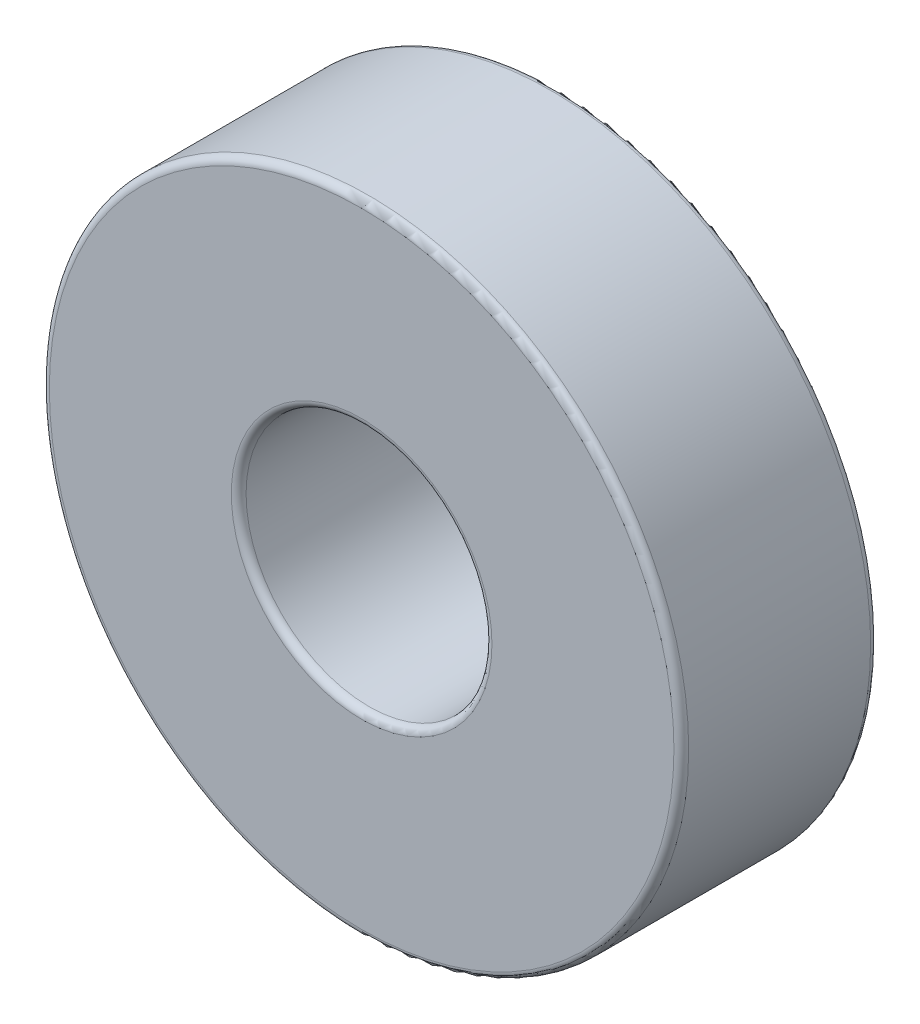
ISO-10303-21;
HEADER;
FILE_DESCRIPTION(('STEP AP214'),'2;1');
FILE_NAME('part.step','',(''),(''),'','','');
FILE_SCHEMA(('AUTOMOTIVE_DESIGN { 1 0 10303 214 1 1 1 1 }'));
ENDSEC;
DATA;
#1=APPLICATION_CONTEXT('core data for automotive mechanical design processes');
#2=APPLICATION_PROTOCOL_DEFINITION('international standard','automotive_design',2000,#1);
#3=PRODUCT_CONTEXT('',#1,'mechanical');
#4=PRODUCT('Part','Part','',(#3));
#5=PRODUCT_RELATED_PRODUCT_CATEGORY('part','',(#4));
#6=PRODUCT_DEFINITION_FORMATION('','',#4);
#7=PRODUCT_DEFINITION_CONTEXT('part definition',#1,'design');
#8=PRODUCT_DEFINITION('design','',#6,#7);
#9=PRODUCT_DEFINITION_SHAPE('','',#8);
#10=(LENGTH_UNIT() NAMED_UNIT(*) SI_UNIT(.MILLI.,.METRE.));
#11=(NAMED_UNIT(*) PLANE_ANGLE_UNIT() SI_UNIT($,.RADIAN.));
#12=(NAMED_UNIT(*) SI_UNIT($,.STERADIAN.) SOLID_ANGLE_UNIT());
#13=UNCERTAINTY_MEASURE_WITH_UNIT(LENGTH_MEASURE(1.E-05),#10,'distance_accuracy_value','');
#14=(GEOMETRIC_REPRESENTATION_CONTEXT(3) GLOBAL_UNCERTAINTY_ASSIGNED_CONTEXT((#13)) GLOBAL_UNIT_ASSIGNED_CONTEXT((#10,
#11,#12)) REPRESENTATION_CONTEXT('',''));
#15=CARTESIAN_POINT('',(0.,0.,0.));
#16=DIRECTION('',(0.,0.,1.));
#17=DIRECTION('',(1.,0.,0.));
#18=AXIS2_PLACEMENT_3D('',#15,#16,#17);
#19=CARTESIAN_POINT('',(0.,5.3,11.5));
#20=DIRECTION('',(0.,0.,1.));
#21=DIRECTION('',(1.,0.,0.));
#22=AXIS2_PLACEMENT_3D('',#19,#20,#21);
#23=PLANE('',#22);
#24=CARTESIAN_POINT('',(0.,0.,11.5));
#25=DIRECTION('',(0.,0.,1.));
#26=DIRECTION('',(1.,0.,0.));
#27=AXIS2_PLACEMENT_3D('',#24,#25,#26);
#28=CIRCLE('',#27,12.7);
#29=CARTESIAN_POINT('',(12.7,0.,11.5));
#30=VERTEX_POINT('',#29);
#31=EDGE_CURVE('E53',#30,#30,#28,.T.);
#32=ORIENTED_EDGE('',*,*,#31,.T.);
#33=EDGE_LOOP('',(#32));
#34=FACE_BOUND('',#33,.T.);
#35=CARTESIAN_POINT('',(0.,0.,11.5));
#36=DIRECTION('',(0.,0.,1.));
#37=DIRECTION('',(1.,0.,0.));
#38=AXIS2_PLACEMENT_3D('',#35,#36,#37);
#39=CIRCLE('',#38,5.3);
#40=CARTESIAN_POINT('',(5.3,0.,11.5));
#41=VERTEX_POINT('',#40);
#42=EDGE_CURVE('E10',#41,#41,#39,.T.);
#43=ORIENTED_EDGE('',*,*,#42,.F.);
#44=EDGE_LOOP('',(#43));
#45=FACE_BOUND('',#44,.T.);
#46=ADVANCED_FACE('F14',(#34,#45),#23,.T.);
#47=CARTESIAN_POINT('',(0.,0.,11.2));
#48=DIRECTION('',(0.,0.,1.));
#49=DIRECTION('',(1.,0.,0.));
#50=AXIS2_PLACEMENT_3D('',#47,#48,#49);
#51=TOROIDAL_SURFACE('',#50,5.3,0.3);
#52=CARTESIAN_POINT('',(0.,0.,11.2));
#53=DIRECTION('',(0.,0.,1.));
#54=DIRECTION('',(1.,0.,0.));
#55=AXIS2_PLACEMENT_3D('',#52,#53,#54);
#56=CIRCLE('',#55,5.);
#57=CARTESIAN_POINT('',(5.,0.,11.2));
#58=VERTEX_POINT('',#57);
#59=EDGE_CURVE('E21',#58,#58,#56,.T.);
#60=ORIENTED_EDGE('',*,*,#59,.F.);
#61=EDGE_LOOP('',(#60));
#62=FACE_BOUND('',#61,.T.);
#63=ORIENTED_EDGE('',*,*,#42,.T.);
#64=EDGE_LOOP('',(#63));
#65=FACE_BOUND('',#64,.T.);
#66=ADVANCED_FACE('F80',(#62,#65),#51,.T.);
#67=CARTESIAN_POINT('',(0.,0.,7.5));
#68=DIRECTION('',(0.,0.,1.));
#69=DIRECTION('',(1.,0.,0.));
#70=AXIS2_PLACEMENT_3D('',#67,#68,#69);
#71=CYLINDRICAL_SURFACE('',#70,5.);
#72=CARTESIAN_POINT('',(0.,0.,3.8));
#73=DIRECTION('',(0.,0.,1.));
#74=DIRECTION('',(1.,0.,0.));
#75=AXIS2_PLACEMENT_3D('',#72,#73,#74);
#76=CIRCLE('',#75,5.);
#77=CARTESIAN_POINT('',(5.,0.,3.8));
#78=VERTEX_POINT('',#77);
#79=EDGE_CURVE('E29',#78,#78,#76,.T.);
#80=ORIENTED_EDGE('',*,*,#79,.F.);
#81=EDGE_LOOP('',(#80));
#82=FACE_BOUND('',#81,.T.);
#83=ORIENTED_EDGE('',*,*,#59,.T.);
#84=EDGE_LOOP('',(#83));
#85=FACE_BOUND('',#84,.T.);
#86=ADVANCED_FACE('F84',(#82,#85),#71,.F.);
#87=CARTESIAN_POINT('',(0.,0.,3.8));
#88=DIRECTION('',(0.,0.,1.));
#89=DIRECTION('',(1.,0.,0.));
#90=AXIS2_PLACEMENT_3D('',#87,#88,#89);
#91=TOROIDAL_SURFACE('',#90,5.3,0.3);
#92=CARTESIAN_POINT('',(0.,0.,3.5));
#93=DIRECTION('',(0.,0.,1.));
#94=DIRECTION('',(1.,0.,0.));
#95=AXIS2_PLACEMENT_3D('',#92,#93,#94);
#96=CIRCLE('',#95,5.3);
#97=CARTESIAN_POINT('',(5.3,0.,3.5));
#98=VERTEX_POINT('',#97);
#99=EDGE_CURVE('E35',#98,#98,#96,.T.);
#100=ORIENTED_EDGE('',*,*,#99,.F.);
#101=EDGE_LOOP('',(#100));
#102=FACE_BOUND('',#101,.T.);
#103=ORIENTED_EDGE('',*,*,#79,.T.);
#104=EDGE_LOOP('',(#103));
#105=FACE_BOUND('',#104,.T.);
#106=ADVANCED_FACE('F89',(#102,#105),#91,.T.);
#107=CARTESIAN_POINT('',(0.,5.3,3.5));
#108=DIRECTION('',(0.,0.,1.));
#109=DIRECTION('',(1.,0.,0.));
#110=AXIS2_PLACEMENT_3D('',#107,#108,#109);
#111=PLANE('',#110);
#112=CARTESIAN_POINT('',(0.,0.,3.5));
#113=DIRECTION('',(0.,0.,1.));
#114=DIRECTION('',(1.,0.,0.));
#115=AXIS2_PLACEMENT_3D('',#112,#113,#114);
#116=CIRCLE('',#115,12.7);
#117=CARTESIAN_POINT('',(12.7,0.,3.5));
#118=VERTEX_POINT('',#117);
#119=EDGE_CURVE('E41',#118,#118,#116,.T.);
#120=ORIENTED_EDGE('',*,*,#119,.F.);
#121=EDGE_LOOP('',(#120));
#122=FACE_BOUND('',#121,.T.);
#123=ORIENTED_EDGE('',*,*,#99,.T.);
#124=EDGE_LOOP('',(#123));
#125=FACE_BOUND('',#124,.T.);
#126=ADVANCED_FACE('F76',(#122,#125),#111,.F.);
#127=CARTESIAN_POINT('',(0.,0.,3.8));
#128=DIRECTION('',(0.,0.,1.));
#129=DIRECTION('',(1.,0.,0.));
#130=AXIS2_PLACEMENT_3D('',#127,#128,#129);
#131=TOROIDAL_SURFACE('',#130,12.7,0.3);
#132=CARTESIAN_POINT('',(0.,0.,3.8));
#133=DIRECTION('',(0.,0.,1.));
#134=DIRECTION('',(1.,0.,0.));
#135=AXIS2_PLACEMENT_3D('',#132,#133,#134);
#136=CIRCLE('',#135,13.);
#137=CARTESIAN_POINT('',(13.,0.,3.8));
#138=VERTEX_POINT('',#137);
#139=EDGE_CURVE('E45',#138,#138,#136,.T.);
#140=ORIENTED_EDGE('',*,*,#139,.F.);
#141=EDGE_LOOP('',(#140));
#142=FACE_BOUND('',#141,.T.);
#143=ORIENTED_EDGE('',*,*,#119,.T.);
#144=EDGE_LOOP('',(#143));
#145=FACE_BOUND('',#144,.T.);
#146=ADVANCED_FACE('F69',(#142,#145),#131,.T.);
#147=CARTESIAN_POINT('',(0.,0.,7.5));
#148=DIRECTION('',(0.,0.,1.));
#149=DIRECTION('',(1.,0.,0.));
#150=AXIS2_PLACEMENT_3D('',#147,#148,#149);
#151=CYLINDRICAL_SURFACE('',#150,13.);
#152=ORIENTED_EDGE('',*,*,#139,.T.);
#153=EDGE_LOOP('',(#152));
#154=FACE_BOUND('',#153,.T.);
#155=CARTESIAN_POINT('',(0.,0.,11.2));
#156=DIRECTION('',(0.,0.,1.));
#157=DIRECTION('',(1.,0.,0.));
#158=AXIS2_PLACEMENT_3D('',#155,#156,#157);
#159=CIRCLE('',#158,13.);
#160=CARTESIAN_POINT('',(13.,0.,11.2));
#161=VERTEX_POINT('',#160);
#162=EDGE_CURVE('E49',#161,#161,#159,.T.);
#163=ORIENTED_EDGE('',*,*,#162,.F.);
#164=EDGE_LOOP('',(#163));
#165=FACE_BOUND('',#164,.T.);
#166=ADVANCED_FACE('F64',(#154,#165),#151,.T.);
#167=CARTESIAN_POINT('',(0.,0.,11.2));
#168=DIRECTION('',(0.,0.,1.));
#169=DIRECTION('',(1.,0.,0.));
#170=AXIS2_PLACEMENT_3D('',#167,#168,#169);
#171=TOROIDAL_SURFACE('',#170,12.7,0.3);
#172=ORIENTED_EDGE('',*,*,#31,.F.);
#173=EDGE_LOOP('',(#172));
#174=FACE_BOUND('',#173,.T.);
#175=ORIENTED_EDGE('',*,*,#162,.T.);
#176=EDGE_LOOP('',(#175));
#177=FACE_BOUND('',#176,.T.);
#178=ADVANCED_FACE('F61',(#174,#177),#171,.T.);
#179=CLOSED_SHELL('',(#46,#66,#86,#106,#126,#146,#166,#178));
#180=MANIFOLD_SOLID_BREP('B1',#179);
#181=ADVANCED_BREP_SHAPE_REPRESENTATION('',(#18,#180),#14);
#182=SHAPE_DEFINITION_REPRESENTATION(#9,#181);
ENDSEC;
END-ISO-10303-21;
